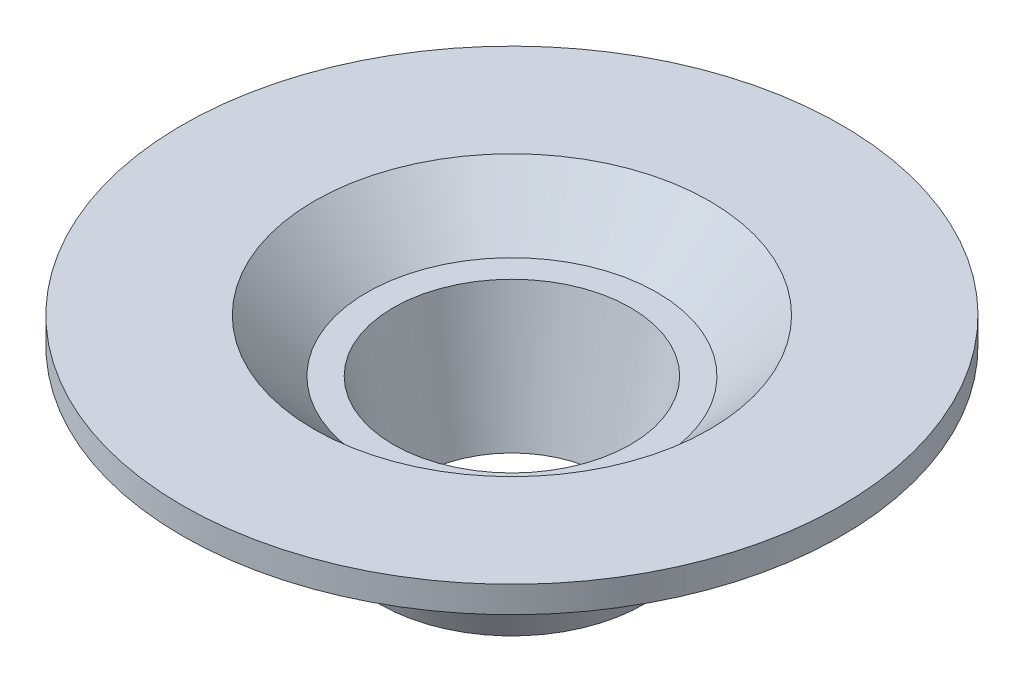
ISO-10303-21;
HEADER;
FILE_DESCRIPTION(('STEP AP214'),'2;1');
FILE_NAME('part.step','',(''),(''),'','','');
FILE_SCHEMA(('AUTOMOTIVE_DESIGN { 1 0 10303 214 1 1 1 1 }'));
ENDSEC;
DATA;
#1=APPLICATION_CONTEXT('core data for automotive mechanical design processes');
#2=APPLICATION_PROTOCOL_DEFINITION('international standard','automotive_design',2000,#1);
#3=PRODUCT_CONTEXT('',#1,'mechanical');
#4=PRODUCT('Part','Part','',(#3));
#5=PRODUCT_RELATED_PRODUCT_CATEGORY('part','',(#4));
#6=PRODUCT_DEFINITION_FORMATION('','',#4);
#7=PRODUCT_DEFINITION_CONTEXT('part definition',#1,'design');
#8=PRODUCT_DEFINITION('design','',#6,#7);
#9=PRODUCT_DEFINITION_SHAPE('','',#8);
#10=(LENGTH_UNIT() NAMED_UNIT(*) SI_UNIT(.MILLI.,.METRE.));
#11=(NAMED_UNIT(*) PLANE_ANGLE_UNIT() SI_UNIT($,.RADIAN.));
#12=(NAMED_UNIT(*) SI_UNIT($,.STERADIAN.) SOLID_ANGLE_UNIT());
#13=UNCERTAINTY_MEASURE_WITH_UNIT(LENGTH_MEASURE(1.E-05),#10,'distance_accuracy_value','');
#14=(GEOMETRIC_REPRESENTATION_CONTEXT(3) GLOBAL_UNCERTAINTY_ASSIGNED_CONTEXT((#13)) GLOBAL_UNIT_ASSIGNED_CONTEXT((#10,
#11,#12)) REPRESENTATION_CONTEXT('',''));
#15=CARTESIAN_POINT('',(0.,0.,0.));
#16=DIRECTION('',(0.,0.,1.));
#17=DIRECTION('',(1.,0.,0.));
#18=AXIS2_PLACEMENT_3D('',#15,#16,#17);
#19=CARTESIAN_POINT('',(0.,0.,-5.5));
#20=DIRECTION('',(0.,-1.,0.));
#21=DIRECTION('',(0.,0.,-1.));
#22=AXIS2_PLACEMENT_3D('',#19,#20,#21);
#23=PLANE('',#22);
#24=CARTESIAN_POINT('',(0.,0.,0.));
#25=DIRECTION('',(0.,1.,0.));
#26=DIRECTION('',(0.,0.,1.));
#27=AXIS2_PLACEMENT_3D('',#24,#25,#26);
#28=CIRCLE('',#27,4.5);
#29=CARTESIAN_POINT('',(0.,0.,4.5));
#30=VERTEX_POINT('',#29);
#31=EDGE_CURVE('E71',#30,#30,#28,.T.);
#32=ORIENTED_EDGE('',*,*,#31,.F.);
#33=EDGE_LOOP('',(#32));
#34=FACE_BOUND('',#33,.T.);
#35=CARTESIAN_POINT('',(0.,0.,0.));
#36=DIRECTION('',(0.,1.,0.));
#37=DIRECTION('',(0.,0.,1.));
#38=AXIS2_PLACEMENT_3D('',#35,#36,#37);
#39=CIRCLE('',#38,5.5);
#40=CARTESIAN_POINT('',(0.,0.,5.5));
#41=VERTEX_POINT('',#40);
#42=EDGE_CURVE('E10',#41,#41,#39,.T.);
#43=ORIENTED_EDGE('',*,*,#42,.T.);
#44=EDGE_LOOP('',(#43));
#45=FACE_BOUND('',#44,.T.);
#46=ADVANCED_FACE('F37',(#34,#45),#23,.F.);
#47=CARTESIAN_POINT('',(0.,2.,0.));
#48=DIRECTION('',(0.,1.,0.));
#49=DIRECTION('',(0.,0.,1.));
#50=AXIS2_PLACEMENT_3D('',#47,#48,#49);
#51=CONICAL_SURFACE('',#50,7.5,0.785398163397448);
#52=ORIENTED_EDGE('',*,*,#42,.F.);
#53=EDGE_LOOP('',(#52));
#54=FACE_BOUND('',#53,.T.);
#55=CARTESIAN_POINT('',(0.,2.,0.));
#56=DIRECTION('',(0.,1.,0.));
#57=DIRECTION('',(0.,0.,1.));
#58=AXIS2_PLACEMENT_3D('',#55,#56,#57);
#59=CIRCLE('',#58,7.5);
#60=CARTESIAN_POINT('',(0.,2.,7.5));
#61=VERTEX_POINT('',#60);
#62=EDGE_CURVE('E43',#61,#61,#59,.T.);
#63=ORIENTED_EDGE('',*,*,#62,.T.);
#64=EDGE_LOOP('',(#63));
#65=FACE_BOUND('',#64,.T.);
#66=ADVANCED_FACE('F78',(#54,#65),#51,.F.);
#67=CARTESIAN_POINT('',(0.,2.,-12.5));
#68=DIRECTION('',(0.,-1.,0.));
#69=DIRECTION('',(0.,0.,-1.));
#70=AXIS2_PLACEMENT_3D('',#67,#68,#69);
#71=PLANE('',#70);
#72=ORIENTED_EDGE('',*,*,#62,.F.);
#73=EDGE_LOOP('',(#72));
#74=FACE_BOUND('',#73,.T.);
#75=CARTESIAN_POINT('',(0.,2.,0.));
#76=DIRECTION('',(0.,1.,0.));
#77=DIRECTION('',(0.,0.,1.));
#78=AXIS2_PLACEMENT_3D('',#75,#76,#77);
#79=CIRCLE('',#78,12.5);
#80=CARTESIAN_POINT('',(0.,2.,12.5));
#81=VERTEX_POINT('',#80);
#82=EDGE_CURVE('E47',#81,#81,#79,.T.);
#83=ORIENTED_EDGE('',*,*,#82,.T.);
#84=EDGE_LOOP('',(#83));
#85=FACE_BOUND('',#84,.T.);
#86=ADVANCED_FACE('F82',(#74,#85),#71,.F.);
#87=CARTESIAN_POINT('',(0.,0.,0.));
#88=DIRECTION('',(0.,1.,0.));
#89=DIRECTION('',(0.,0.,1.));
#90=AXIS2_PLACEMENT_3D('',#87,#88,#89);
#91=CYLINDRICAL_SURFACE('',#90,12.5);
#92=ORIENTED_EDGE('',*,*,#82,.F.);
#93=EDGE_LOOP('',(#92));
#94=FACE_BOUND('',#93,.T.);
#95=CARTESIAN_POINT('',(0.,1.,0.));
#96=DIRECTION('',(0.,1.,0.));
#97=DIRECTION('',(0.,0.,1.));
#98=AXIS2_PLACEMENT_3D('',#95,#96,#97);
#99=CIRCLE('',#98,12.5);
#100=CARTESIAN_POINT('',(0.,1.,12.5));
#101=VERTEX_POINT('',#100);
#102=EDGE_CURVE('E51',#101,#101,#99,.T.);
#103=ORIENTED_EDGE('',*,*,#102,.T.);
#104=EDGE_LOOP('',(#103));
#105=FACE_BOUND('',#104,.T.);
#106=ADVANCED_FACE('F87',(#94,#105),#91,.T.);
#107=CARTESIAN_POINT('',(0.,1.,-10.5));
#108=DIRECTION('',(0.,1.,0.));
#109=DIRECTION('',(0.,0.,1.));
#110=AXIS2_PLACEMENT_3D('',#107,#108,#109);
#111=PLANE('',#110);
#112=ORIENTED_EDGE('',*,*,#102,.F.);
#113=EDGE_LOOP('',(#112));
#114=FACE_BOUND('',#113,.T.);
#115=CARTESIAN_POINT('',(0.,1.,0.));
#116=DIRECTION('',(0.,1.,0.));
#117=DIRECTION('',(0.,0.,1.));
#118=AXIS2_PLACEMENT_3D('',#115,#116,#117);
#119=CIRCLE('',#118,10.5);
#120=CARTESIAN_POINT('',(0.,1.,10.5));
#121=VERTEX_POINT('',#120);
#122=EDGE_CURVE('E56',#121,#121,#119,.T.);
#123=ORIENTED_EDGE('',*,*,#122,.T.);
#124=EDGE_LOOP('',(#123));
#125=FACE_BOUND('',#124,.T.);
#126=ADVANCED_FACE('F93',(#114,#125),#111,.F.);
#127=CARTESIAN_POINT('',(0.,-1.,0.));
#128=DIRECTION('',(0.,1.,0.));
#129=DIRECTION('',(0.,0.,1.));
#130=AXIS2_PLACEMENT_3D('',#127,#128,#129);
#131=CONICAL_SURFACE('',#130,8.5,0.785398163397448);
#132=ORIENTED_EDGE('',*,*,#122,.F.);
#133=EDGE_LOOP('',(#132));
#134=FACE_BOUND('',#133,.T.);
#135=CARTESIAN_POINT('',(0.,-1.,0.));
#136=DIRECTION('',(0.,1.,0.));
#137=DIRECTION('',(0.,0.,1.));
#138=AXIS2_PLACEMENT_3D('',#135,#136,#137);
#139=CIRCLE('',#138,8.5);
#140=CARTESIAN_POINT('',(0.,-1.,8.5));
#141=VERTEX_POINT('',#140);
#142=EDGE_CURVE('E59',#141,#141,#139,.T.);
#143=ORIENTED_EDGE('',*,*,#142,.T.);
#144=EDGE_LOOP('',(#143));
#145=FACE_BOUND('',#144,.T.);
#146=ADVANCED_FACE('F97',(#134,#145),#131,.T.);
#147=CARTESIAN_POINT('',(0.,-1.,-6.5));
#148=DIRECTION('',(0.,1.,0.));
#149=DIRECTION('',(0.,0.,1.));
#150=AXIS2_PLACEMENT_3D('',#147,#148,#149);
#151=PLANE('',#150);
#152=ORIENTED_EDGE('',*,*,#142,.F.);
#153=EDGE_LOOP('',(#152));
#154=FACE_BOUND('',#153,.T.);
#155=CARTESIAN_POINT('',(0.,-1.,0.));
#156=DIRECTION('',(0.,1.,0.));
#157=DIRECTION('',(0.,0.,1.));
#158=AXIS2_PLACEMENT_3D('',#155,#156,#157);
#159=CIRCLE('',#158,6.5);
#160=CARTESIAN_POINT('',(0.,-1.,6.5));
#161=VERTEX_POINT('',#160);
#162=EDGE_CURVE('E62',#161,#161,#159,.T.);
#163=ORIENTED_EDGE('',*,*,#162,.T.);
#164=EDGE_LOOP('',(#163));
#165=FACE_BOUND('',#164,.T.);
#166=ADVANCED_FACE('F101',(#154,#165),#151,.F.);
#167=CARTESIAN_POINT('',(0.,-5.,0.));
#168=DIRECTION('',(0.,1.,0.));
#169=DIRECTION('',(0.,0.,1.));
#170=AXIS2_PLACEMENT_3D('',#167,#168,#169);
#171=CONICAL_SURFACE('',#170,5.,0.358770670270572);
#172=ORIENTED_EDGE('',*,*,#162,.F.);
#173=EDGE_LOOP('',(#172));
#174=FACE_BOUND('',#173,.T.);
#175=CARTESIAN_POINT('',(0.,-5.,0.));
#176=DIRECTION('',(0.,1.,0.));
#177=DIRECTION('',(0.,0.,1.));
#178=AXIS2_PLACEMENT_3D('',#175,#176,#177);
#179=CIRCLE('',#178,5.);
#180=CARTESIAN_POINT('',(0.,-5.,5.));
#181=VERTEX_POINT('',#180);
#182=EDGE_CURVE('E65',#181,#181,#179,.T.);
#183=ORIENTED_EDGE('',*,*,#182,.T.);
#184=EDGE_LOOP('',(#183));
#185=FACE_BOUND('',#184,.T.);
#186=ADVANCED_FACE('F105',(#174,#185),#171,.T.);
#187=CARTESIAN_POINT('',(0.,-5.,-3.5));
#188=DIRECTION('',(0.,1.,0.));
#189=DIRECTION('',(0.,0.,1.));
#190=AXIS2_PLACEMENT_3D('',#187,#188,#189);
#191=PLANE('',#190);
#192=ORIENTED_EDGE('',*,*,#182,.F.);
#193=EDGE_LOOP('',(#192));
#194=FACE_BOUND('',#193,.T.);
#195=CARTESIAN_POINT('',(0.,-5.,0.));
#196=DIRECTION('',(0.,1.,0.));
#197=DIRECTION('',(0.,0.,1.));
#198=AXIS2_PLACEMENT_3D('',#195,#196,#197);
#199=CIRCLE('',#198,3.5);
#200=CARTESIAN_POINT('',(0.,-5.,3.5));
#201=VERTEX_POINT('',#200);
#202=EDGE_CURVE('E68',#201,#201,#199,.T.);
#203=ORIENTED_EDGE('',*,*,#202,.T.);
#204=EDGE_LOOP('',(#203));
#205=FACE_BOUND('',#204,.T.);
#206=ADVANCED_FACE('F109',(#194,#205),#191,.F.);
#207=CARTESIAN_POINT('',(0.,0.,0.));
#208=DIRECTION('',(0.,1.,0.));
#209=DIRECTION('',(0.,0.,1.));
#210=AXIS2_PLACEMENT_3D('',#207,#208,#209);
#211=CONICAL_SURFACE('',#210,4.5,0.197395559849881);
#212=ORIENTED_EDGE('',*,*,#202,.F.);
#213=EDGE_LOOP('',(#212));
#214=FACE_BOUND('',#213,.T.);
#215=ORIENTED_EDGE('',*,*,#31,.T.);
#216=EDGE_LOOP('',(#215));
#217=FACE_BOUND('',#216,.T.);
#218=ADVANCED_FACE('F75',(#214,#217),#211,.F.);
#219=CLOSED_SHELL('',(#46,#66,#86,#106,#126,#146,#166,#186,#206,#218));
#220=MANIFOLD_SOLID_BREP('B2',#219);
#221=ADVANCED_BREP_SHAPE_REPRESENTATION('',(#18,#220),#14);
#222=SHAPE_DEFINITION_REPRESENTATION(#9,#221);
ENDSEC;
END-ISO-10303-21;
